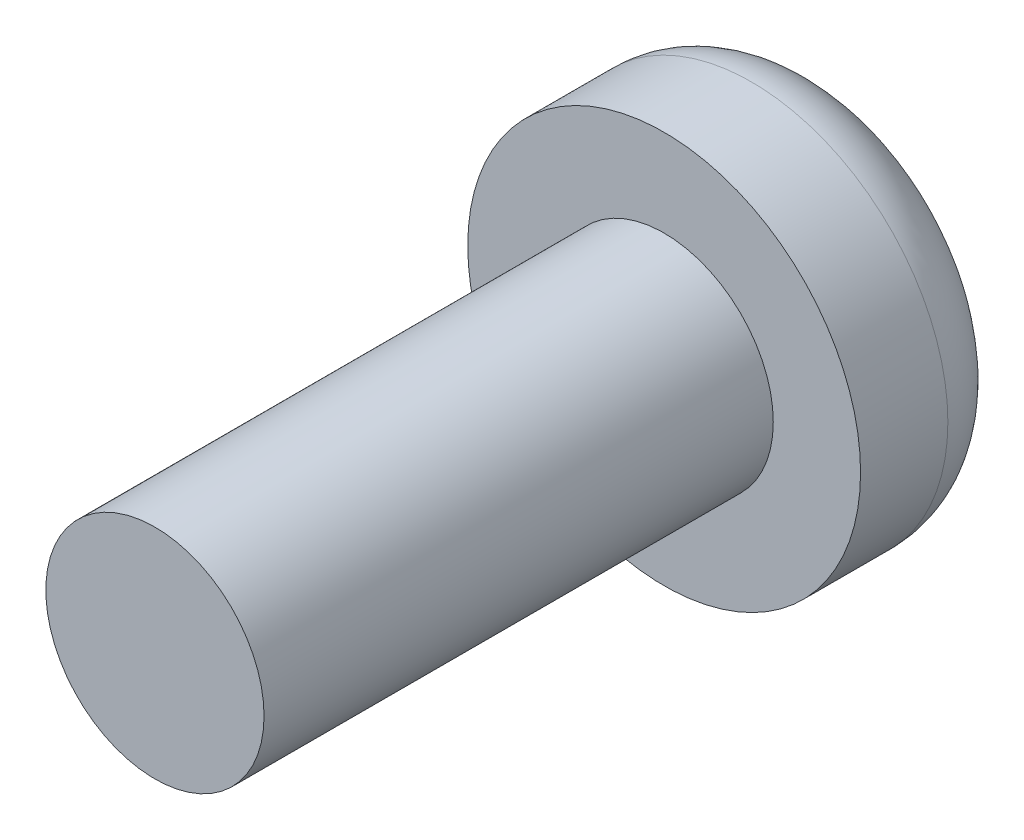
ISO-10303-21;
HEADER;
FILE_DESCRIPTION(('STEP AP214'),'2;1');
FILE_NAME('part.step','',(''),(''),'','','');
FILE_SCHEMA(('AUTOMOTIVE_DESIGN { 1 0 10303 214 1 1 1 1 }'));
ENDSEC;
DATA;
#1=APPLICATION_CONTEXT('core data for automotive mechanical design processes');
#2=APPLICATION_PROTOCOL_DEFINITION('international standard','automotive_design',2000,#1);
#3=PRODUCT_CONTEXT('',#1,'mechanical');
#4=PRODUCT('Part','Part','',(#3));
#5=PRODUCT_RELATED_PRODUCT_CATEGORY('part','',(#4));
#6=PRODUCT_DEFINITION_FORMATION('','',#4);
#7=PRODUCT_DEFINITION_CONTEXT('part definition',#1,'design');
#8=PRODUCT_DEFINITION('design','',#6,#7);
#9=PRODUCT_DEFINITION_SHAPE('','',#8);
#10=(LENGTH_UNIT() NAMED_UNIT(*) SI_UNIT(.MILLI.,.METRE.));
#11=(NAMED_UNIT(*) PLANE_ANGLE_UNIT() SI_UNIT($,.RADIAN.));
#12=(NAMED_UNIT(*) SI_UNIT($,.STERADIAN.) SOLID_ANGLE_UNIT());
#13=UNCERTAINTY_MEASURE_WITH_UNIT(LENGTH_MEASURE(1.E-05),#10,'distance_accuracy_value','');
#14=(GEOMETRIC_REPRESENTATION_CONTEXT(3) GLOBAL_UNCERTAINTY_ASSIGNED_CONTEXT((#13)) GLOBAL_UNIT_ASSIGNED_CONTEXT((#10,
#11,#12)) REPRESENTATION_CONTEXT('',''));
#15=CARTESIAN_POINT('',(0.,0.,0.));
#16=DIRECTION('',(0.,0.,1.));
#17=DIRECTION('',(1.,0.,0.));
#18=AXIS2_PLACEMENT_3D('',#15,#16,#17);
#19=CARTESIAN_POINT('',(0.,0.,7.));
#20=DIRECTION('',(0.,0.,-1.));
#21=DIRECTION('',(-1.,0.,0.));
#22=AXIS2_PLACEMENT_3D('',#19,#20,#21);
#23=CYLINDRICAL_SURFACE('',#22,1.5);
#24=CARTESIAN_POINT('',(0.,0.,7.));
#25=DIRECTION('',(0.,0.,1.));
#26=DIRECTION('',(1.,0.,0.));
#27=AXIS2_PLACEMENT_3D('',#24,#25,#26);
#28=CIRCLE('',#27,1.5);
#29=CARTESIAN_POINT('',(1.5,0.,7.));
#30=VERTEX_POINT('',#29);
#31=EDGE_CURVE('E50',#30,#30,#28,.T.);
#32=ORIENTED_EDGE('',*,*,#31,.F.);
#33=EDGE_LOOP('',(#32));
#34=FACE_BOUND('',#33,.T.);
#35=CARTESIAN_POINT('',(0.,0.,0.));
#36=DIRECTION('',(0.,0.,1.));
#37=DIRECTION('',(1.,0.,0.));
#38=AXIS2_PLACEMENT_3D('',#35,#36,#37);
#39=CIRCLE('',#38,1.5);
#40=CARTESIAN_POINT('',(1.5,0.,0.));
#41=VERTEX_POINT('',#40);
#42=EDGE_CURVE('E55',#41,#41,#39,.T.);
#43=ORIENTED_EDGE('',*,*,#42,.T.);
#44=EDGE_LOOP('',(#43));
#45=FACE_BOUND('',#44,.T.);
#46=ADVANCED_FACE('F37',(#34,#45),#23,.T.);
#47=CARTESIAN_POINT('',(0.,0.,7.));
#48=DIRECTION('',(0.,0.,1.));
#49=DIRECTION('',(1.,0.,0.));
#50=AXIS2_PLACEMENT_3D('',#47,#48,#49);
#51=PLANE('',#50);
#52=ORIENTED_EDGE('',*,*,#31,.T.);
#53=EDGE_LOOP('',(#52));
#54=FACE_BOUND('',#53,.T.);
#55=ADVANCED_FACE('F82',(#54),#51,.T.);
#56=CARTESIAN_POINT('',(0.,0.,-2.2));
#57=DIRECTION('',(0.,0.,1.));
#58=DIRECTION('',(1.,0.,0.));
#59=AXIS2_PLACEMENT_3D('',#56,#57,#58);
#60=CYLINDRICAL_SURFACE('',#59,2.7);
#61=CARTESIAN_POINT('',(0.,0.,-1.2));
#62=DIRECTION('',(0.,0.,-1.));
#63=DIRECTION('',(-1.,0.,0.));
#64=AXIS2_PLACEMENT_3D('',#61,#62,#63);
#65=CIRCLE('',#64,2.7);
#66=CARTESIAN_POINT('',(-2.7,0.,-1.2));
#67=VERTEX_POINT('',#66);
#68=EDGE_CURVE('E10',#67,#67,#65,.F.);
#69=ORIENTED_EDGE('',*,*,#68,.T.);
#70=EDGE_LOOP('',(#69));
#71=FACE_BOUND('',#70,.T.);
#72=CARTESIAN_POINT('',(0.,0.,0.));
#73=DIRECTION('',(0.,0.,-1.));
#74=DIRECTION('',(-1.,0.,0.));
#75=AXIS2_PLACEMENT_3D('',#72,#73,#74);
#76=CIRCLE('',#75,2.7);
#77=CARTESIAN_POINT('',(-2.7,0.,0.));
#78=VERTEX_POINT('',#77);
#79=EDGE_CURVE('E60',#78,#78,#76,.T.);
#80=ORIENTED_EDGE('',*,*,#79,.T.);
#81=EDGE_LOOP('',(#80));
#82=FACE_BOUND('',#81,.T.);
#83=ADVANCED_FACE('F66',(#71,#82),#60,.T.);
#84=CARTESIAN_POINT('',(0.,0.,-2.2));
#85=DIRECTION('',(0.,0.,-1.));
#86=DIRECTION('',(-1.,0.,0.));
#87=AXIS2_PLACEMENT_3D('',#84,#85,#86);
#88=PLANE('',#87);
#89=CARTESIAN_POINT('',(0.,0.,-2.2));
#90=DIRECTION('',(0.,0.,-1.));
#91=DIRECTION('',(-1.,0.,0.));
#92=AXIS2_PLACEMENT_3D('',#89,#90,#91);
#93=CIRCLE('',#92,1.7);
#94=CARTESIAN_POINT('',(-1.7,0.,-2.2));
#95=VERTEX_POINT('',#94);
#96=EDGE_CURVE('E45',#95,#95,#93,.T.);
#97=ORIENTED_EDGE('',*,*,#96,.T.);
#98=EDGE_LOOP('',(#97));
#99=FACE_BOUND('',#98,.T.);
#100=ADVANCED_FACE('F70',(#99),#88,.T.);
#101=CARTESIAN_POINT('',(0.,0.,0.));
#102=DIRECTION('',(0.,0.,-1.));
#103=DIRECTION('',(-1.,0.,0.));
#104=AXIS2_PLACEMENT_3D('',#101,#102,#103);
#105=PLANE('',#104);
#106=ORIENTED_EDGE('',*,*,#42,.F.);
#107=EDGE_LOOP('',(#106));
#108=FACE_BOUND('',#107,.T.);
#109=ORIENTED_EDGE('',*,*,#79,.F.);
#110=EDGE_LOOP('',(#109));
#111=FACE_BOUND('',#110,.T.);
#112=ADVANCED_FACE('F68',(#108,#111),#105,.F.);
#113=CARTESIAN_POINT('',(0.,0.,-1.2));
#114=DIRECTION('',(0.,0.,-1.));
#115=DIRECTION('',(-1.,0.,0.));
#116=AXIS2_PLACEMENT_3D('',#113,#114,#115);
#117=TOROIDAL_SURFACE('',#116,1.7,1.);
#118=ORIENTED_EDGE('',*,*,#68,.F.);
#119=EDGE_LOOP('',(#118));
#120=FACE_BOUND('',#119,.T.);
#121=ORIENTED_EDGE('',*,*,#96,.F.);
#122=EDGE_LOOP('',(#121));
#123=FACE_BOUND('',#122,.T.);
#124=ADVANCED_FACE('F39',(#120,#123),#117,.T.);
#125=CLOSED_SHELL('',(#46,#55,#83,#100,#112,#124));
#126=MANIFOLD_SOLID_BREP('B2',#125);
#127=ADVANCED_BREP_SHAPE_REPRESENTATION('',(#18,#126),#14);
#128=SHAPE_DEFINITION_REPRESENTATION(#9,#127);
ENDSEC;
END-ISO-10303-21;
